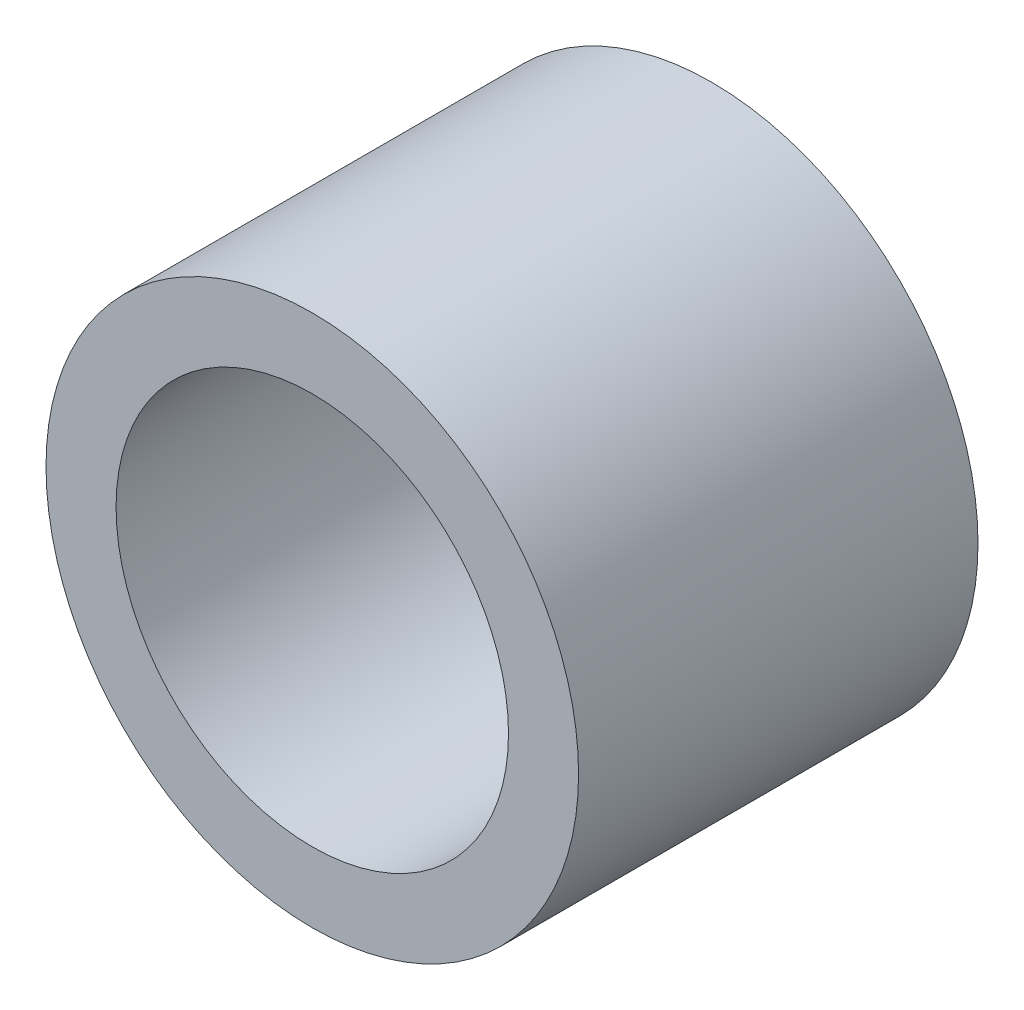
ISO-10303-21;
HEADER;
FILE_DESCRIPTION(('STEP AP214'),'2;1');
FILE_NAME('part.step','',(''),(''),'','','');
FILE_SCHEMA(('AUTOMOTIVE_DESIGN { 1 0 10303 214 1 1 1 1 }'));
ENDSEC;
DATA;
#1=APPLICATION_CONTEXT('core data for automotive mechanical design processes');
#2=APPLICATION_PROTOCOL_DEFINITION('international standard','automotive_design',2000,#1);
#3=PRODUCT_CONTEXT('',#1,'mechanical');
#4=PRODUCT('Part','Part','',(#3));
#5=PRODUCT_RELATED_PRODUCT_CATEGORY('part','',(#4));
#6=PRODUCT_DEFINITION_FORMATION('','',#4);
#7=PRODUCT_DEFINITION_CONTEXT('part definition',#1,'design');
#8=PRODUCT_DEFINITION('design','',#6,#7);
#9=PRODUCT_DEFINITION_SHAPE('','',#8);
#10=(LENGTH_UNIT() NAMED_UNIT(*) SI_UNIT(.MILLI.,.METRE.));
#11=(NAMED_UNIT(*) PLANE_ANGLE_UNIT() SI_UNIT($,.RADIAN.));
#12=(NAMED_UNIT(*) SI_UNIT($,.STERADIAN.) SOLID_ANGLE_UNIT());
#13=UNCERTAINTY_MEASURE_WITH_UNIT(LENGTH_MEASURE(1.E-05),#10,'distance_accuracy_value','');
#14=(GEOMETRIC_REPRESENTATION_CONTEXT(3) GLOBAL_UNCERTAINTY_ASSIGNED_CONTEXT((#13)) GLOBAL_UNIT_ASSIGNED_CONTEXT((#10,
#11,#12)) REPRESENTATION_CONTEXT('',''));
#15=CARTESIAN_POINT('',(0.,0.,0.));
#16=DIRECTION('',(0.,0.,1.));
#17=DIRECTION('',(1.,0.,0.));
#18=AXIS2_PLACEMENT_3D('',#15,#16,#17);
#19=CARTESIAN_POINT('',(0.,0.,5.7));
#20=DIRECTION('',(0.,0.,1.));
#21=DIRECTION('',(1.,0.,0.));
#22=AXIS2_PLACEMENT_3D('',#19,#20,#21);
#23=PLANE('',#22);
#24=CARTESIAN_POINT('',(0.,0.,5.7));
#25=DIRECTION('',(0.,0.,1.));
#26=DIRECTION('',(1.,0.,0.));
#27=AXIS2_PLACEMENT_3D('',#24,#25,#26);
#28=CIRCLE('',#27,3.8);
#29=CARTESIAN_POINT('',(3.8,0.,5.7));
#30=VERTEX_POINT('',#29);
#31=EDGE_CURVE('E10',#30,#30,#28,.T.);
#32=ORIENTED_EDGE('',*,*,#31,.T.);
#33=EDGE_LOOP('',(#32));
#34=FACE_BOUND('',#33,.T.);
#35=CARTESIAN_POINT('',(0.,0.,5.7));
#36=DIRECTION('',(0.,0.,1.));
#37=DIRECTION('',(1.,0.,0.));
#38=AXIS2_PLACEMENT_3D('',#35,#36,#37);
#39=CIRCLE('',#38,2.8);
#40=CARTESIAN_POINT('',(2.8,0.,5.7));
#41=VERTEX_POINT('',#40);
#42=EDGE_CURVE('E50',#41,#41,#39,.T.);
#43=ORIENTED_EDGE('',*,*,#42,.F.);
#44=EDGE_LOOP('',(#43));
#45=FACE_BOUND('',#44,.T.);
#46=ADVANCED_FACE('F37',(#34,#45),#23,.T.);
#47=CARTESIAN_POINT('',(0.,0.,0.));
#48=DIRECTION('',(0.,0.,1.));
#49=DIRECTION('',(1.,0.,0.));
#50=AXIS2_PLACEMENT_3D('',#47,#48,#49);
#51=PLANE('',#50);
#52=CARTESIAN_POINT('',(0.,0.,0.));
#53=DIRECTION('',(0.,0.,1.));
#54=DIRECTION('',(1.,0.,0.));
#55=AXIS2_PLACEMENT_3D('',#52,#53,#54);
#56=CIRCLE('',#55,3.8);
#57=CARTESIAN_POINT('',(3.8,0.,0.));
#58=VERTEX_POINT('',#57);
#59=EDGE_CURVE('E41',#58,#58,#56,.T.);
#60=ORIENTED_EDGE('',*,*,#59,.F.);
#61=EDGE_LOOP('',(#60));
#62=FACE_BOUND('',#61,.T.);
#63=CARTESIAN_POINT('',(0.,0.,0.));
#64=DIRECTION('',(0.,0.,1.));
#65=DIRECTION('',(1.,0.,0.));
#66=AXIS2_PLACEMENT_3D('',#63,#64,#65);
#67=CIRCLE('',#66,2.8);
#68=CARTESIAN_POINT('',(2.8,0.,0.));
#69=VERTEX_POINT('',#68);
#70=EDGE_CURVE('E52',#69,#69,#67,.T.);
#71=ORIENTED_EDGE('',*,*,#70,.T.);
#72=EDGE_LOOP('',(#71));
#73=FACE_BOUND('',#72,.T.);
#74=ADVANCED_FACE('F64',(#62,#73),#51,.F.);
#75=CARTESIAN_POINT('',(0.,0.,5.7));
#76=DIRECTION('',(0.,0.,-1.));
#77=DIRECTION('',(-1.,0.,0.));
#78=AXIS2_PLACEMENT_3D('',#75,#76,#77);
#79=CYLINDRICAL_SURFACE('',#78,3.8);
#80=ORIENTED_EDGE('',*,*,#31,.F.);
#81=EDGE_LOOP('',(#80));
#82=FACE_BOUND('',#81,.T.);
#83=ORIENTED_EDGE('',*,*,#59,.T.);
#84=EDGE_LOOP('',(#83));
#85=FACE_BOUND('',#84,.T.);
#86=ADVANCED_FACE('F39',(#82,#85),#79,.T.);
#87=CARTESIAN_POINT('',(0.,0.,5.7));
#88=DIRECTION('',(0.,0.,-1.));
#89=DIRECTION('',(-1.,0.,0.));
#90=AXIS2_PLACEMENT_3D('',#87,#88,#89);
#91=CYLINDRICAL_SURFACE('',#90,2.8);
#92=ORIENTED_EDGE('',*,*,#42,.T.);
#93=EDGE_LOOP('',(#92));
#94=FACE_BOUND('',#93,.T.);
#95=ORIENTED_EDGE('',*,*,#70,.F.);
#96=EDGE_LOOP('',(#95));
#97=FACE_BOUND('',#96,.T.);
#98=ADVANCED_FACE('F60',(#94,#97),#91,.F.);
#99=CLOSED_SHELL('',(#46,#74,#86,#98));
#100=MANIFOLD_SOLID_BREP('B2',#99);
#101=ADVANCED_BREP_SHAPE_REPRESENTATION('',(#18,#100),#14);
#102=SHAPE_DEFINITION_REPRESENTATION(#9,#101);
ENDSEC;
END-ISO-10303-21;
